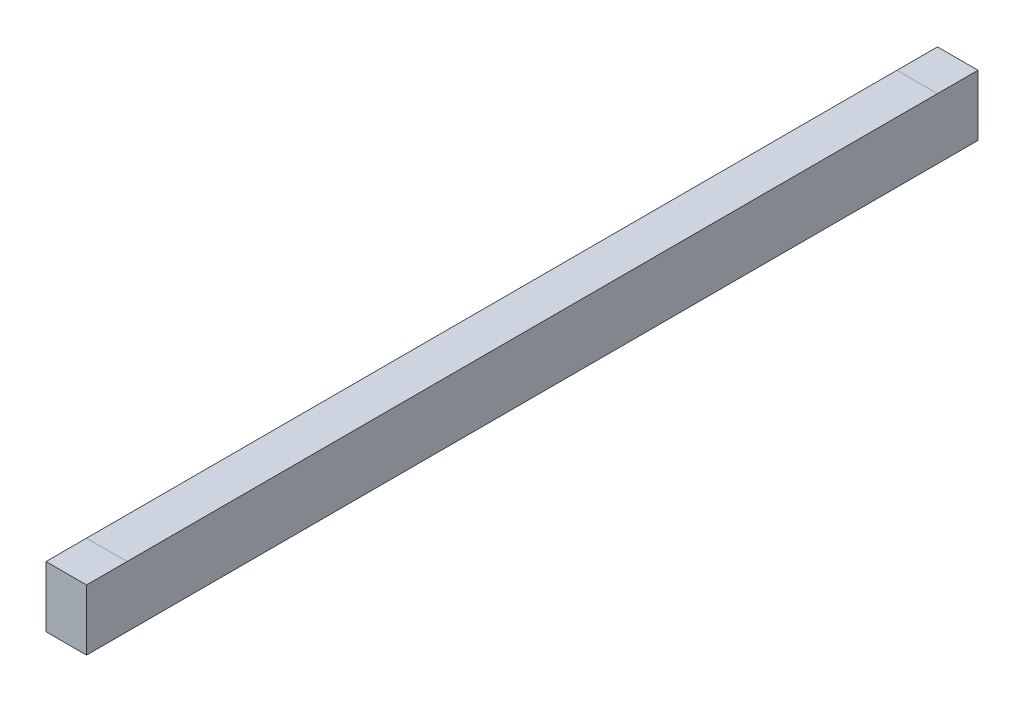
ISO-10303-21;
HEADER;
FILE_DESCRIPTION(('STEP AP214'),'2;1');
FILE_NAME('part.step','',(''),(''),'','','');
FILE_SCHEMA(('AUTOMOTIVE_DESIGN { 1 0 10303 214 1 1 1 1 }'));
ENDSEC;
DATA;
#1=APPLICATION_CONTEXT('core data for automotive mechanical design processes');
#2=APPLICATION_PROTOCOL_DEFINITION('international standard','automotive_design',2000,#1);
#3=PRODUCT_CONTEXT('',#1,'mechanical');
#4=PRODUCT('Part','Part','',(#3));
#5=PRODUCT_RELATED_PRODUCT_CATEGORY('part','',(#4));
#6=PRODUCT_DEFINITION_FORMATION('','',#4);
#7=PRODUCT_DEFINITION_CONTEXT('part definition',#1,'design');
#8=PRODUCT_DEFINITION('design','',#6,#7);
#9=PRODUCT_DEFINITION_SHAPE('','',#8);
#10=(LENGTH_UNIT() NAMED_UNIT(*) SI_UNIT(.MILLI.,.METRE.));
#11=(NAMED_UNIT(*) PLANE_ANGLE_UNIT() SI_UNIT($,.RADIAN.));
#12=(NAMED_UNIT(*) SI_UNIT($,.STERADIAN.) SOLID_ANGLE_UNIT());
#13=UNCERTAINTY_MEASURE_WITH_UNIT(LENGTH_MEASURE(1.E-05),#10,'distance_accuracy_value','');
#14=(GEOMETRIC_REPRESENTATION_CONTEXT(3) GLOBAL_UNCERTAINTY_ASSIGNED_CONTEXT((#13)) GLOBAL_UNIT_ASSIGNED_CONTEXT((#10,
#11,#12)) REPRESENTATION_CONTEXT('',''));
#15=CARTESIAN_POINT('',(0.,0.,0.));
#16=DIRECTION('',(0.,0.,1.));
#17=DIRECTION('',(1.,0.,0.));
#18=AXIS2_PLACEMENT_3D('',#15,#16,#17);
#19=CARTESIAN_POINT('',(0.,0.,2200.));
#20=DIRECTION('',(0.,1.,0.));
#21=DIRECTION('',(0.,0.,1.));
#22=AXIS2_PLACEMENT_3D('',#19,#20,#21);
#23=PLANE('',#22);
#24=DIRECTION('',(-1.,0.,0.));
#25=VECTOR('',#24,1.);
#26=CARTESIAN_POINT('',(0.,0.,100.));
#27=LINE('',#26,#25);
#28=CARTESIAN_POINT('',(100.,0.,100.));
#29=VERTEX_POINT('',#28);
#30=CARTESIAN_POINT('',(0.,0.,100.));
#31=VERTEX_POINT('',#30);
#32=EDGE_CURVE('E12',#29,#31,#27,.T.);
#33=ORIENTED_EDGE('',*,*,#32,.F.);
#34=DIRECTION('',(0.,0.,-1.));
#35=VECTOR('',#34,1.);
#36=CARTESIAN_POINT('',(100.,0.,2200.));
#37=LINE('',#36,#35);
#38=CARTESIAN_POINT('',(100.,0.,2100.));
#39=VERTEX_POINT('',#38);
#40=EDGE_CURVE('E149',#39,#29,#37,.T.);
#41=ORIENTED_EDGE('',*,*,#40,.F.);
#42=DIRECTION('',(-1.,0.,0.));
#43=VECTOR('',#42,1.);
#44=CARTESIAN_POINT('',(0.,0.,2100.));
#45=LINE('',#44,#43);
#46=CARTESIAN_POINT('',(0.,0.,2100.));
#47=VERTEX_POINT('',#46);
#48=EDGE_CURVE('E143',#39,#47,#45,.T.);
#49=ORIENTED_EDGE('',*,*,#48,.T.);
#50=DIRECTION('',(0.,0.,-1.));
#51=VECTOR('',#50,1.);
#52=CARTESIAN_POINT('',(0.,0.,2200.));
#53=LINE('',#52,#51);
#54=EDGE_CURVE('E138',#47,#31,#53,.T.);
#55=ORIENTED_EDGE('',*,*,#54,.T.);
#56=EDGE_LOOP('',(#33,#41,#49,#55));
#57=FACE_BOUND('',#56,.T.);
#58=ADVANCED_FACE('F52',(#57),#23,.F.);
#59=CARTESIAN_POINT('',(0.,150.,2200.));
#60=DIRECTION('',(0.,-1.,0.));
#61=DIRECTION('',(0.,0.,-1.));
#62=AXIS2_PLACEMENT_3D('',#59,#60,#61);
#63=PLANE('',#62);
#64=DIRECTION('',(1.,0.,0.));
#65=VECTOR('',#64,1.);
#66=CARTESIAN_POINT('',(0.,150.,100.));
#67=LINE('',#66,#65);
#68=CARTESIAN_POINT('',(0.,150.,100.));
#69=VERTEX_POINT('',#68);
#70=CARTESIAN_POINT('',(100.,150.,100.));
#71=VERTEX_POINT('',#70);
#72=EDGE_CURVE('E56',#69,#71,#67,.T.);
#73=ORIENTED_EDGE('',*,*,#72,.F.);
#74=DIRECTION('',(0.,0.,-1.));
#75=VECTOR('',#74,1.);
#76=CARTESIAN_POINT('',(0.,150.,2200.));
#77=LINE('',#76,#75);
#78=CARTESIAN_POINT('',(0.,150.,2100.));
#79=VERTEX_POINT('',#78);
#80=EDGE_CURVE('E167',#79,#69,#77,.T.);
#81=ORIENTED_EDGE('',*,*,#80,.F.);
#82=DIRECTION('',(1.,0.,0.));
#83=VECTOR('',#82,1.);
#84=CARTESIAN_POINT('',(0.,150.,2100.));
#85=LINE('',#84,#83);
#86=CARTESIAN_POINT('',(100.,150.,2100.));
#87=VERTEX_POINT('',#86);
#88=EDGE_CURVE('E139',#79,#87,#85,.T.);
#89=ORIENTED_EDGE('',*,*,#88,.T.);
#90=DIRECTION('',(0.,0.,-1.));
#91=VECTOR('',#90,1.);
#92=CARTESIAN_POINT('',(100.,150.,2200.));
#93=LINE('',#92,#91);
#94=EDGE_CURVE('E157',#87,#71,#93,.T.);
#95=ORIENTED_EDGE('',*,*,#94,.T.);
#96=EDGE_LOOP('',(#73,#81,#89,#95));
#97=FACE_BOUND('',#96,.T.);
#98=ADVANCED_FACE('F199',(#97),#63,.F.);
#99=ORIENTED_EDGE('',*,*,#48,.F.);
#100=CARTESIAN_POINT('',(100.,0.,2200.));
#101=VERTEX_POINT('',#100);
#102=EDGE_CURVE('E121',#101,#39,#37,.T.);
#103=ORIENTED_EDGE('',*,*,#102,.F.);
#104=DIRECTION('',(1.,0.,0.));
#105=VECTOR('',#104,1.);
#106=CARTESIAN_POINT('',(0.,0.,2200.));
#107=LINE('',#106,#105);
#108=CARTESIAN_POINT('',(0.,0.,2200.));
#109=VERTEX_POINT('',#108);
#110=EDGE_CURVE('E115',#109,#101,#107,.T.);
#111=ORIENTED_EDGE('',*,*,#110,.F.);
#112=EDGE_CURVE('E119',#109,#47,#53,.T.);
#113=ORIENTED_EDGE('',*,*,#112,.T.);
#114=EDGE_LOOP('',(#99,#103,#111,#113));
#115=FACE_BOUND('',#114,.T.);
#116=ADVANCED_FACE('F117',(#115),#23,.F.);
#117=ORIENTED_EDGE('',*,*,#88,.F.);
#118=CARTESIAN_POINT('',(0.,150.,2200.));
#119=VERTEX_POINT('',#118);
#120=EDGE_CURVE('E163',#119,#79,#77,.T.);
#121=ORIENTED_EDGE('',*,*,#120,.F.);
#122=DIRECTION('',(-1.,0.,0.));
#123=VECTOR('',#122,1.);
#124=CARTESIAN_POINT('',(0.,150.,2200.));
#125=LINE('',#124,#123);
#126=CARTESIAN_POINT('',(100.,150.,2200.));
#127=VERTEX_POINT('',#126);
#128=EDGE_CURVE('E130',#127,#119,#125,.T.);
#129=ORIENTED_EDGE('',*,*,#128,.F.);
#130=EDGE_CURVE('E154',#127,#87,#93,.T.);
#131=ORIENTED_EDGE('',*,*,#130,.T.);
#132=EDGE_LOOP('',(#117,#121,#129,#131));
#133=FACE_BOUND('',#132,.T.);
#134=ADVANCED_FACE('F200',(#133),#63,.F.);
#135=CARTESIAN_POINT('',(0.,0.,2200.));
#136=DIRECTION('',(1.,0.,0.));
#137=DIRECTION('',(0.,0.,-1.));
#138=AXIS2_PLACEMENT_3D('',#135,#136,#137);
#139=PLANE('',#138);
#140=DIRECTION('',(0.,-1.,0.));
#141=VECTOR('',#140,1.);
#142=CARTESIAN_POINT('',(0.,0.,0.));
#143=LINE('',#142,#141);
#144=CARTESIAN_POINT('',(0.,150.,0.));
#145=VERTEX_POINT('',#144);
#146=CARTESIAN_POINT('',(0.,0.,0.));
#147=VERTEX_POINT('',#146);
#148=EDGE_CURVE('E175',#145,#147,#143,.T.);
#149=ORIENTED_EDGE('',*,*,#148,.T.);
#150=EDGE_CURVE('E141',#31,#147,#53,.T.);
#151=ORIENTED_EDGE('',*,*,#150,.F.);
#152=ORIENTED_EDGE('',*,*,#54,.F.);
#153=ORIENTED_EDGE('',*,*,#112,.F.);
#154=DIRECTION('',(0.,-1.,0.));
#155=VECTOR('',#154,1.);
#156=CARTESIAN_POINT('',(0.,0.,2200.));
#157=LINE('',#156,#155);
#158=EDGE_CURVE('E125',#119,#109,#157,.T.);
#159=ORIENTED_EDGE('',*,*,#158,.F.);
#160=ORIENTED_EDGE('',*,*,#120,.T.);
#161=ORIENTED_EDGE('',*,*,#80,.T.);
#162=EDGE_CURVE('E168',#69,#145,#77,.T.);
#163=ORIENTED_EDGE('',*,*,#162,.T.);
#164=EDGE_LOOP('',(#149,#151,#152,#153,#159,#160,#161,#163));
#165=FACE_BOUND('',#164,.T.);
#166=ADVANCED_FACE('F54',(#165),#139,.F.);
#167=CARTESIAN_POINT('',(100.,0.,0.));
#168=VERTEX_POINT('',#167);
#169=EDGE_CURVE('E150',#29,#168,#37,.T.);
#170=ORIENTED_EDGE('',*,*,#169,.F.);
#171=ORIENTED_EDGE('',*,*,#32,.T.);
#172=ORIENTED_EDGE('',*,*,#150,.T.);
#173=DIRECTION('',(1.,0.,0.));
#174=VECTOR('',#173,1.);
#175=CARTESIAN_POINT('',(0.,0.,0.));
#176=LINE('',#175,#174);
#177=EDGE_CURVE('E177',#147,#168,#176,.T.);
#178=ORIENTED_EDGE('',*,*,#177,.T.);
#179=EDGE_LOOP('',(#170,#171,#172,#178));
#180=FACE_BOUND('',#179,.T.);
#181=ADVANCED_FACE('F207',(#180),#23,.F.);
#182=CARTESIAN_POINT('',(100.,0.,2200.));
#183=DIRECTION('',(-1.,0.,0.));
#184=DIRECTION('',(0.,0.,1.));
#185=AXIS2_PLACEMENT_3D('',#182,#183,#184);
#186=PLANE('',#185);
#187=DIRECTION('',(0.,1.,0.));
#188=VECTOR('',#187,1.);
#189=CARTESIAN_POINT('',(100.,0.,0.));
#190=LINE('',#189,#188);
#191=CARTESIAN_POINT('',(100.,150.,0.));
#192=VERTEX_POINT('',#191);
#193=EDGE_CURVE('E178',#168,#192,#190,.T.);
#194=ORIENTED_EDGE('',*,*,#193,.T.);
#195=EDGE_CURVE('E158',#71,#192,#93,.T.);
#196=ORIENTED_EDGE('',*,*,#195,.F.);
#197=ORIENTED_EDGE('',*,*,#94,.F.);
#198=ORIENTED_EDGE('',*,*,#130,.F.);
#199=DIRECTION('',(0.,1.,0.));
#200=VECTOR('',#199,1.);
#201=CARTESIAN_POINT('',(100.,0.,2200.));
#202=LINE('',#201,#200);
#203=EDGE_CURVE('E124',#101,#127,#202,.T.);
#204=ORIENTED_EDGE('',*,*,#203,.F.);
#205=ORIENTED_EDGE('',*,*,#102,.T.);
#206=ORIENTED_EDGE('',*,*,#40,.T.);
#207=ORIENTED_EDGE('',*,*,#169,.T.);
#208=EDGE_LOOP('',(#194,#196,#197,#198,#204,#205,#206,#207));
#209=FACE_BOUND('',#208,.T.);
#210=ADVANCED_FACE('F198',(#209),#186,.F.);
#211=ORIENTED_EDGE('',*,*,#162,.F.);
#212=ORIENTED_EDGE('',*,*,#72,.T.);
#213=ORIENTED_EDGE('',*,*,#195,.T.);
#214=DIRECTION('',(-1.,0.,0.));
#215=VECTOR('',#214,1.);
#216=CARTESIAN_POINT('',(0.,150.,0.));
#217=LINE('',#216,#215);
#218=EDGE_CURVE('E134',#192,#145,#217,.T.);
#219=ORIENTED_EDGE('',*,*,#218,.T.);
#220=EDGE_LOOP('',(#211,#212,#213,#219));
#221=FACE_BOUND('',#220,.T.);
#222=ADVANCED_FACE('F183',(#221),#63,.F.);
#223=CARTESIAN_POINT('',(0.,0.,2200.));
#224=DIRECTION('',(0.,0.,-1.));
#225=DIRECTION('',(-1.,0.,0.));
#226=AXIS2_PLACEMENT_3D('',#223,#224,#225);
#227=PLANE('',#226);
#228=ORIENTED_EDGE('',*,*,#158,.T.);
#229=ORIENTED_EDGE('',*,*,#110,.T.);
#230=ORIENTED_EDGE('',*,*,#203,.T.);
#231=ORIENTED_EDGE('',*,*,#128,.T.);
#232=EDGE_LOOP('',(#228,#229,#230,#231));
#233=FACE_BOUND('',#232,.T.);
#234=ADVANCED_FACE('F128',(#233),#227,.F.);
#235=CARTESIAN_POINT('',(0.,0.,0.));
#236=DIRECTION('',(0.,0.,-1.));
#237=DIRECTION('',(-1.,0.,0.));
#238=AXIS2_PLACEMENT_3D('',#235,#236,#237);
#239=PLANE('',#238);
#240=ORIENTED_EDGE('',*,*,#148,.F.);
#241=ORIENTED_EDGE('',*,*,#218,.F.);
#242=ORIENTED_EDGE('',*,*,#193,.F.);
#243=ORIENTED_EDGE('',*,*,#177,.F.);
#244=EDGE_LOOP('',(#240,#241,#242,#243));
#245=FACE_BOUND('',#244,.T.);
#246=ADVANCED_FACE('F186',(#245),#239,.T.);
#247=CLOSED_SHELL('',(#58,#98,#116,#134,#166,#181,#210,#222,#234,#246));
#248=MANIFOLD_SOLID_BREP('B2',#247);
#249=ADVANCED_BREP_SHAPE_REPRESENTATION('',(#18,#248),#14);
#250=SHAPE_DEFINITION_REPRESENTATION(#9,#249);
ENDSEC;
END-ISO-10303-21;
